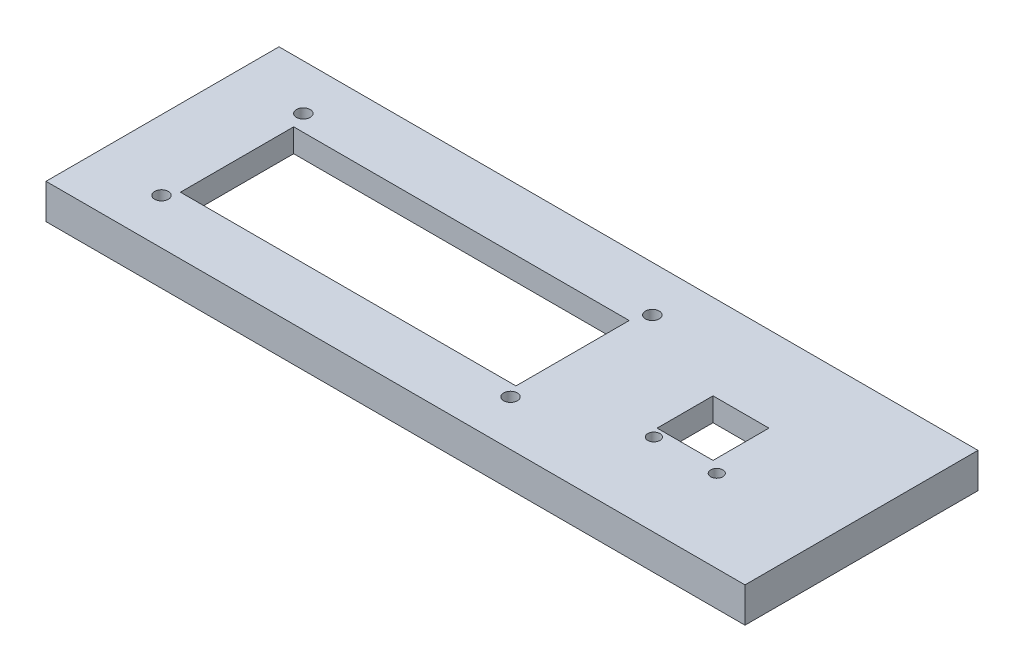
ISO-10303-21;
HEADER;
FILE_DESCRIPTION(('STEP AP214'),'2;1');
FILE_NAME('part.step','',(''),(''),'','','');
FILE_SCHEMA(('AUTOMOTIVE_DESIGN { 1 0 10303 214 1 1 1 1 }'));
ENDSEC;
DATA;
#1=APPLICATION_CONTEXT('core data for automotive mechanical design processes');
#2=APPLICATION_PROTOCOL_DEFINITION('international standard','automotive_design',2000,#1);
#3=PRODUCT_CONTEXT('',#1,'mechanical');
#4=PRODUCT('Part','Part','',(#3));
#5=PRODUCT_RELATED_PRODUCT_CATEGORY('part','',(#4));
#6=PRODUCT_DEFINITION_FORMATION('','',#4);
#7=PRODUCT_DEFINITION_CONTEXT('part definition',#1,'design');
#8=PRODUCT_DEFINITION('design','',#6,#7);
#9=PRODUCT_DEFINITION_SHAPE('','',#8);
#10=(LENGTH_UNIT() NAMED_UNIT(*) SI_UNIT(.MILLI.,.METRE.));
#11=(NAMED_UNIT(*) PLANE_ANGLE_UNIT() SI_UNIT($,.RADIAN.));
#12=(NAMED_UNIT(*) SI_UNIT($,.STERADIAN.) SOLID_ANGLE_UNIT());
#13=UNCERTAINTY_MEASURE_WITH_UNIT(LENGTH_MEASURE(1.E-05),#10,'distance_accuracy_value','');
#14=(GEOMETRIC_REPRESENTATION_CONTEXT(3) GLOBAL_UNCERTAINTY_ASSIGNED_CONTEXT((#13)) GLOBAL_UNIT_ASSIGNED_CONTEXT((#10,
#11,#12)) REPRESENTATION_CONTEXT('',''));
#15=CARTESIAN_POINT('',(0.,0.,0.));
#16=DIRECTION('',(0.,0.,1.));
#17=DIRECTION('',(1.,0.,0.));
#18=AXIS2_PLACEMENT_3D('',#15,#16,#17);
#19=CARTESIAN_POINT('',(15.,0.,-40.2163222930002));
#20=DIRECTION('',(0.,1.,0.));
#21=DIRECTION('',(0.,0.,1.));
#22=AXIS2_PLACEMENT_3D('',#19,#20,#21);
#23=CYLINDRICAL_SURFACE('',#22,1.475);
#24=CARTESIAN_POINT('',(15.,7.5,-40.2163222930002));
#25=DIRECTION('',(0.,1.,0.));
#26=DIRECTION('',(0.,0.,1.));
#27=AXIS2_PLACEMENT_3D('',#24,#25,#26);
#28=CIRCLE('',#27,1.475);
#29=CARTESIAN_POINT('',(15.,7.5,-38.7413222930003));
#30=VERTEX_POINT('',#29);
#31=EDGE_CURVE('E253',#30,#30,#28,.T.);
#32=ORIENTED_EDGE('',*,*,#31,.T.);
#33=EDGE_LOOP('',(#32));
#34=FACE_BOUND('',#33,.T.);
#35=CARTESIAN_POINT('',(15.,2.5,-40.2163222930002));
#36=DIRECTION('',(0.,-1.,0.));
#37=DIRECTION('',(0.,0.,-1.));
#38=AXIS2_PLACEMENT_3D('',#35,#36,#37);
#39=CIRCLE('',#38,1.475);
#40=CARTESIAN_POINT('',(15.,2.5,-41.6913222930002));
#41=VERTEX_POINT('',#40);
#42=EDGE_CURVE('E240',#41,#41,#39,.F.);
#43=ORIENTED_EDGE('',*,*,#42,.F.);
#44=EDGE_LOOP('',(#43));
#45=FACE_BOUND('',#44,.T.);
#46=ADVANCED_FACE('F39',(#34,#45),#23,.F.);
#47=CARTESIAN_POINT('',(89.9,0.,-40.2163222930002));
#48=DIRECTION('',(0.,1.,0.));
#49=DIRECTION('',(0.,0.,1.));
#50=AXIS2_PLACEMENT_3D('',#47,#48,#49);
#51=CYLINDRICAL_SURFACE('',#50,1.475);
#52=CARTESIAN_POINT('',(89.9,7.5,-40.2163222930002));
#53=DIRECTION('',(0.,1.,0.));
#54=DIRECTION('',(0.,0.,1.));
#55=AXIS2_PLACEMENT_3D('',#52,#53,#54);
#56=CIRCLE('',#55,1.475);
#57=CARTESIAN_POINT('',(89.9,7.5,-38.7413222930003));
#58=VERTEX_POINT('',#57);
#59=EDGE_CURVE('E250',#58,#58,#56,.T.);
#60=ORIENTED_EDGE('',*,*,#59,.T.);
#61=EDGE_LOOP('',(#60));
#62=FACE_BOUND('',#61,.T.);
#63=CARTESIAN_POINT('',(89.9,2.5,-40.2163222930002));
#64=DIRECTION('',(0.,-1.,0.));
#65=DIRECTION('',(0.,0.,-1.));
#66=AXIS2_PLACEMENT_3D('',#63,#64,#65);
#67=CIRCLE('',#66,1.475);
#68=CARTESIAN_POINT('',(89.9,2.5,-41.6913222930002));
#69=VERTEX_POINT('',#68);
#70=EDGE_CURVE('E237',#69,#69,#67,.F.);
#71=ORIENTED_EDGE('',*,*,#70,.F.);
#72=EDGE_LOOP('',(#71));
#73=FACE_BOUND('',#72,.T.);
#74=ADVANCED_FACE('F327',(#62,#73),#51,.F.);
#75=CARTESIAN_POINT('',(89.9,0.,-9.78367770699974));
#76=DIRECTION('',(0.,1.,0.));
#77=DIRECTION('',(0.,0.,1.));
#78=AXIS2_PLACEMENT_3D('',#75,#76,#77);
#79=CYLINDRICAL_SURFACE('',#78,1.475);
#80=CARTESIAN_POINT('',(89.9,7.5,-9.78367770699974));
#81=DIRECTION('',(0.,1.,0.));
#82=DIRECTION('',(0.,0.,1.));
#83=AXIS2_PLACEMENT_3D('',#80,#81,#82);
#84=CIRCLE('',#83,1.475);
#85=CARTESIAN_POINT('',(89.9,7.5,-8.30867770699974));
#86=VERTEX_POINT('',#85);
#87=EDGE_CURVE('E254',#86,#86,#84,.T.);
#88=ORIENTED_EDGE('',*,*,#87,.T.);
#89=EDGE_LOOP('',(#88));
#90=FACE_BOUND('',#89,.T.);
#91=CARTESIAN_POINT('',(89.9,2.5,-9.78367770699974));
#92=DIRECTION('',(0.,-1.,0.));
#93=DIRECTION('',(0.,0.,-1.));
#94=AXIS2_PLACEMENT_3D('',#91,#92,#93);
#95=CIRCLE('',#94,1.475);
#96=CARTESIAN_POINT('',(89.9,2.5,-11.2586777069997));
#97=VERTEX_POINT('',#96);
#98=EDGE_CURVE('E234',#97,#97,#95,.F.);
#99=ORIENTED_EDGE('',*,*,#98,.F.);
#100=EDGE_LOOP('',(#99));
#101=FACE_BOUND('',#100,.T.);
#102=ADVANCED_FACE('F334',(#90,#101),#79,.F.);
#103=CARTESIAN_POINT('',(15.,0.,-9.78367770699972));
#104=DIRECTION('',(0.,1.,0.));
#105=DIRECTION('',(0.,0.,1.));
#106=AXIS2_PLACEMENT_3D('',#103,#104,#105);
#107=CYLINDRICAL_SURFACE('',#106,1.475);
#108=CARTESIAN_POINT('',(15.,7.5,-9.78367770699972));
#109=DIRECTION('',(0.,1.,0.));
#110=DIRECTION('',(0.,0.,1.));
#111=AXIS2_PLACEMENT_3D('',#108,#109,#110);
#112=CIRCLE('',#111,1.475);
#113=CARTESIAN_POINT('',(15.,7.5,-8.30867770699972));
#114=VERTEX_POINT('',#113);
#115=EDGE_CURVE('E247',#114,#114,#112,.T.);
#116=ORIENTED_EDGE('',*,*,#115,.T.);
#117=EDGE_LOOP('',(#116));
#118=FACE_BOUND('',#117,.T.);
#119=CARTESIAN_POINT('',(15.,2.5,-9.78367770699972));
#120=DIRECTION('',(0.,-1.,0.));
#121=DIRECTION('',(0.,0.,-1.));
#122=AXIS2_PLACEMENT_3D('',#119,#120,#121);
#123=CIRCLE('',#122,1.475);
#124=CARTESIAN_POINT('',(15.,2.5,-11.2586777069997));
#125=VERTEX_POINT('',#124);
#126=EDGE_CURVE('E231',#125,#125,#123,.F.);
#127=ORIENTED_EDGE('',*,*,#126,.F.);
#128=EDGE_LOOP('',(#127));
#129=FACE_BOUND('',#128,.T.);
#130=ADVANCED_FACE('F340',(#118,#129),#107,.F.);
#131=CARTESIAN_POINT('',(126.238384591535,0.,-17.7));
#132=DIRECTION('',(0.,1.,0.));
#133=DIRECTION('',(0.,0.,1.));
#134=AXIS2_PLACEMENT_3D('',#131,#132,#133);
#135=CYLINDRICAL_SURFACE('',#134,1.30000000000001);
#136=CARTESIAN_POINT('',(126.238384591535,7.5,-17.7));
#137=DIRECTION('',(0.,1.,0.));
#138=DIRECTION('',(0.,0.,1.));
#139=AXIS2_PLACEMENT_3D('',#136,#137,#138);
#140=CIRCLE('',#139,1.30000000000001);
#141=CARTESIAN_POINT('',(126.238384591535,7.5,-16.4));
#142=VERTEX_POINT('',#141);
#143=EDGE_CURVE('E243',#142,#142,#140,.T.);
#144=ORIENTED_EDGE('',*,*,#143,.T.);
#145=EDGE_LOOP('',(#144));
#146=FACE_BOUND('',#145,.T.);
#147=CARTESIAN_POINT('',(126.238384591535,2.5,-17.7));
#148=DIRECTION('',(0.,-1.,0.));
#149=DIRECTION('',(0.,0.,-1.));
#150=AXIS2_PLACEMENT_3D('',#147,#148,#149);
#151=CIRCLE('',#150,1.30000000000001);
#152=CARTESIAN_POINT('',(126.238384591535,2.5,-19.));
#153=VERTEX_POINT('',#152);
#154=EDGE_CURVE('E228',#153,#153,#151,.F.);
#155=ORIENTED_EDGE('',*,*,#154,.F.);
#156=EDGE_LOOP('',(#155));
#157=FACE_BOUND('',#156,.T.);
#158=ADVANCED_FACE('F378',(#146,#157),#135,.F.);
#159=CARTESIAN_POINT('',(112.738384591535,0.,-17.7));
#160=DIRECTION('',(0.,1.,0.));
#161=DIRECTION('',(0.,0.,1.));
#162=AXIS2_PLACEMENT_3D('',#159,#160,#161);
#163=CYLINDRICAL_SURFACE('',#162,1.29999999999999);
#164=CARTESIAN_POINT('',(112.738384591535,7.5,-17.7));
#165=DIRECTION('',(0.,1.,0.));
#166=DIRECTION('',(0.,0.,1.));
#167=AXIS2_PLACEMENT_3D('',#164,#165,#166);
#168=CIRCLE('',#167,1.29999999999999);
#169=CARTESIAN_POINT('',(112.738384591535,7.5,-16.4));
#170=VERTEX_POINT('',#169);
#171=EDGE_CURVE('E244',#170,#170,#168,.T.);
#172=ORIENTED_EDGE('',*,*,#171,.T.);
#173=EDGE_LOOP('',(#172));
#174=FACE_BOUND('',#173,.T.);
#175=CARTESIAN_POINT('',(112.738384591535,2.5,-17.7));
#176=DIRECTION('',(0.,-1.,0.));
#177=DIRECTION('',(0.,0.,-1.));
#178=AXIS2_PLACEMENT_3D('',#175,#176,#177);
#179=CIRCLE('',#178,1.29999999999999);
#180=CARTESIAN_POINT('',(112.738384591535,2.5,-19.));
#181=VERTEX_POINT('',#180);
#182=EDGE_CURVE('E227',#181,#181,#179,.F.);
#183=ORIENTED_EDGE('',*,*,#182,.F.);
#184=EDGE_LOOP('',(#183));
#185=FACE_BOUND('',#184,.T.);
#186=ADVANCED_FACE('F361',(#174,#185),#163,.F.);
#187=CARTESIAN_POINT('',(0.,7.5,0.));
#188=DIRECTION('',(1.,0.,0.));
#189=DIRECTION('',(0.,0.,-1.));
#190=AXIS2_PLACEMENT_3D('',#187,#188,#189);
#191=PLANE('',#190);
#192=DIRECTION('',(0.,0.,1.));
#193=VECTOR('',#192,1.);
#194=CARTESIAN_POINT('',(0.,0.,0.));
#195=LINE('',#194,#193);
#196=CARTESIAN_POINT('',(0.,0.,-50.));
#197=VERTEX_POINT('',#196);
#198=CARTESIAN_POINT('',(0.,0.,0.));
#199=VERTEX_POINT('',#198);
#200=EDGE_CURVE('E261',#197,#199,#195,.T.);
#201=ORIENTED_EDGE('',*,*,#200,.T.);
#202=DIRECTION('',(0.,-1.,0.));
#203=VECTOR('',#202,1.);
#204=CARTESIAN_POINT('',(0.,7.5,0.));
#205=LINE('',#204,#203);
#206=CARTESIAN_POINT('',(0.,7.5,0.));
#207=VERTEX_POINT('',#206);
#208=EDGE_CURVE('E288',#207,#199,#205,.T.);
#209=ORIENTED_EDGE('',*,*,#208,.F.);
#210=DIRECTION('',(0.,0.,1.));
#211=VECTOR('',#210,1.);
#212=CARTESIAN_POINT('',(0.,7.5,0.));
#213=LINE('',#212,#211);
#214=CARTESIAN_POINT('',(0.,7.5,-50.));
#215=VERTEX_POINT('',#214);
#216=EDGE_CURVE('E262',#215,#207,#213,.T.);
#217=ORIENTED_EDGE('',*,*,#216,.F.);
#218=DIRECTION('',(0.,-1.,0.));
#219=VECTOR('',#218,1.);
#220=CARTESIAN_POINT('',(0.,7.5,-50.));
#221=LINE('',#220,#219);
#222=EDGE_CURVE('E272',#215,#197,#221,.T.);
#223=ORIENTED_EDGE('',*,*,#222,.T.);
#224=EDGE_LOOP('',(#201,#209,#217,#223));
#225=FACE_BOUND('',#224,.T.);
#226=ADVANCED_FACE('F41',(#225),#191,.F.);
#227=CARTESIAN_POINT('',(0.,7.5,0.));
#228=DIRECTION('',(0.,0.,-1.));
#229=DIRECTION('',(-1.,0.,0.));
#230=AXIS2_PLACEMENT_3D('',#227,#228,#229);
#231=PLANE('',#230);
#232=DIRECTION('',(1.,0.,0.));
#233=VECTOR('',#232,1.);
#234=CARTESIAN_POINT('',(0.,0.,0.));
#235=LINE('',#234,#233);
#236=CARTESIAN_POINT('',(150.,0.,0.));
#237=VERTEX_POINT('',#236);
#238=EDGE_CURVE('E275',#199,#237,#235,.T.);
#239=ORIENTED_EDGE('',*,*,#238,.T.);
#240=DIRECTION('',(0.,-1.,0.));
#241=VECTOR('',#240,1.);
#242=CARTESIAN_POINT('',(150.,7.5,0.));
#243=LINE('',#242,#241);
#244=CARTESIAN_POINT('',(150.,7.5,0.));
#245=VERTEX_POINT('',#244);
#246=EDGE_CURVE('E285',#245,#237,#243,.T.);
#247=ORIENTED_EDGE('',*,*,#246,.F.);
#248=DIRECTION('',(1.,0.,0.));
#249=VECTOR('',#248,1.);
#250=CARTESIAN_POINT('',(0.,7.5,0.));
#251=LINE('',#250,#249);
#252=EDGE_CURVE('E265',#207,#245,#251,.T.);
#253=ORIENTED_EDGE('',*,*,#252,.F.);
#254=ORIENTED_EDGE('',*,*,#208,.T.);
#255=EDGE_LOOP('',(#239,#247,#253,#254));
#256=FACE_BOUND('',#255,.T.);
#257=ADVANCED_FACE('F354',(#256),#231,.F.);
#258=CARTESIAN_POINT('',(150.,7.5,0.));
#259=DIRECTION('',(-1.,0.,0.));
#260=DIRECTION('',(0.,0.,1.));
#261=AXIS2_PLACEMENT_3D('',#258,#259,#260);
#262=PLANE('',#261);
#263=DIRECTION('',(0.,0.,-1.));
#264=VECTOR('',#263,1.);
#265=CARTESIAN_POINT('',(150.,0.,0.));
#266=LINE('',#265,#264);
#267=CARTESIAN_POINT('',(150.,0.,-50.));
#268=VERTEX_POINT('',#267);
#269=EDGE_CURVE('E277',#237,#268,#266,.T.);
#270=ORIENTED_EDGE('',*,*,#269,.T.);
#271=DIRECTION('',(0.,-1.,0.));
#272=VECTOR('',#271,1.);
#273=CARTESIAN_POINT('',(150.,7.5,-50.));
#274=LINE('',#273,#272);
#275=CARTESIAN_POINT('',(150.,7.5,-50.));
#276=VERTEX_POINT('',#275);
#277=EDGE_CURVE('E282',#276,#268,#274,.T.);
#278=ORIENTED_EDGE('',*,*,#277,.F.);
#279=DIRECTION('',(0.,0.,-1.));
#280=VECTOR('',#279,1.);
#281=CARTESIAN_POINT('',(150.,7.5,0.));
#282=LINE('',#281,#280);
#283=EDGE_CURVE('E268',#245,#276,#282,.T.);
#284=ORIENTED_EDGE('',*,*,#283,.F.);
#285=ORIENTED_EDGE('',*,*,#246,.T.);
#286=EDGE_LOOP('',(#270,#278,#284,#285));
#287=FACE_BOUND('',#286,.T.);
#288=ADVANCED_FACE('F351',(#287),#262,.F.);
#289=CARTESIAN_POINT('',(0.,7.5,-50.));
#290=DIRECTION('',(0.,0.,1.));
#291=DIRECTION('',(1.,0.,0.));
#292=AXIS2_PLACEMENT_3D('',#289,#290,#291);
#293=PLANE('',#292);
#294=DIRECTION('',(-1.,0.,0.));
#295=VECTOR('',#294,1.);
#296=CARTESIAN_POINT('',(0.,0.,-50.));
#297=LINE('',#296,#295);
#298=EDGE_CURVE('E266',#268,#197,#297,.T.);
#299=ORIENTED_EDGE('',*,*,#298,.T.);
#300=ORIENTED_EDGE('',*,*,#222,.F.);
#301=DIRECTION('',(-1.,0.,0.));
#302=VECTOR('',#301,1.);
#303=CARTESIAN_POINT('',(0.,7.5,-50.));
#304=LINE('',#303,#302);
#305=EDGE_CURVE('E270',#276,#215,#304,.T.);
#306=ORIENTED_EDGE('',*,*,#305,.F.);
#307=ORIENTED_EDGE('',*,*,#277,.T.);
#308=EDGE_LOOP('',(#299,#300,#306,#307));
#309=FACE_BOUND('',#308,.T.);
#310=ADVANCED_FACE('F345',(#309),#293,.F.);
#311=CARTESIAN_POINT('',(0.,7.5,0.));
#312=DIRECTION('',(0.,-1.,0.));
#313=DIRECTION('',(0.,0.,-1.));
#314=AXIS2_PLACEMENT_3D('',#311,#312,#313);
#315=PLANE('',#314);
#316=DIRECTION('',(1.,0.,0.));
#317=VECTOR('',#316,1.);
#318=CARTESIAN_POINT('',(111.438384591535,7.5,-19.7));
#319=LINE('',#318,#317);
#320=CARTESIAN_POINT('',(111.438384591535,7.5,-19.7));
#321=VERTEX_POINT('',#320);
#322=CARTESIAN_POINT('',(123.438384591535,7.5,-19.7));
#323=VERTEX_POINT('',#322);
#324=EDGE_CURVE('E163',#321,#323,#319,.T.);
#325=ORIENTED_EDGE('',*,*,#324,.F.);
#326=DIRECTION('',(0.,0.,1.));
#327=VECTOR('',#326,1.);
#328=CARTESIAN_POINT('',(111.438384591535,7.5,-31.7));
#329=LINE('',#328,#327);
#330=CARTESIAN_POINT('',(111.438384591535,7.5,-31.7));
#331=VERTEX_POINT('',#330);
#332=EDGE_CURVE('E54',#331,#321,#329,.T.);
#333=ORIENTED_EDGE('',*,*,#332,.F.);
#334=DIRECTION('',(-1.,0.,0.));
#335=VECTOR('',#334,1.);
#336=CARTESIAN_POINT('',(111.438384591535,7.5,-31.7));
#337=LINE('',#336,#335);
#338=CARTESIAN_POINT('',(123.438384591535,7.5,-31.7));
#339=VERTEX_POINT('',#338);
#340=EDGE_CURVE('E170',#339,#331,#337,.T.);
#341=ORIENTED_EDGE('',*,*,#340,.F.);
#342=DIRECTION('',(0.,0.,-1.));
#343=VECTOR('',#342,1.);
#344=CARTESIAN_POINT('',(123.438384591535,7.5,-31.7));
#345=LINE('',#344,#343);
#346=EDGE_CURVE('E154',#323,#339,#345,.T.);
#347=ORIENTED_EDGE('',*,*,#346,.F.);
#348=EDGE_LOOP('',(#325,#333,#341,#347));
#349=FACE_BOUND('',#348,.T.);
#350=DIRECTION('',(1.,0.,0.));
#351=VECTOR('',#350,1.);
#352=CARTESIAN_POINT('',(16.45,7.5,-12.4));
#353=LINE('',#352,#351);
#354=CARTESIAN_POINT('',(16.45,7.5,-12.4));
#355=VERTEX_POINT('',#354);
#356=CARTESIAN_POINT('',(88.45,7.5,-12.4));
#357=VERTEX_POINT('',#356);
#358=EDGE_CURVE('E181',#355,#357,#353,.T.);
#359=ORIENTED_EDGE('',*,*,#358,.F.);
#360=DIRECTION('',(0.,0.,1.));
#361=VECTOR('',#360,1.);
#362=CARTESIAN_POINT('',(16.45,7.5,-36.7));
#363=LINE('',#362,#361);
#364=CARTESIAN_POINT('',(16.45,7.5,-36.7));
#365=VERTEX_POINT('',#364);
#366=EDGE_CURVE('E177',#365,#355,#363,.T.);
#367=ORIENTED_EDGE('',*,*,#366,.F.);
#368=DIRECTION('',(-1.,0.,0.));
#369=VECTOR('',#368,1.);
#370=CARTESIAN_POINT('',(16.45,7.5,-36.7));
#371=LINE('',#370,#369);
#372=CARTESIAN_POINT('',(88.45,7.5,-36.7));
#373=VERTEX_POINT('',#372);
#374=EDGE_CURVE('E187',#373,#365,#371,.T.);
#375=ORIENTED_EDGE('',*,*,#374,.F.);
#376=DIRECTION('',(0.,0.,-1.));
#377=VECTOR('',#376,1.);
#378=CARTESIAN_POINT('',(88.45,7.5,-36.7));
#379=LINE('',#378,#377);
#380=EDGE_CURVE('E184',#357,#373,#379,.T.);
#381=ORIENTED_EDGE('',*,*,#380,.F.);
#382=EDGE_LOOP('',(#359,#367,#375,#381));
#383=FACE_BOUND('',#382,.T.);
#384=ORIENTED_EDGE('',*,*,#171,.F.);
#385=EDGE_LOOP('',(#384));
#386=FACE_BOUND('',#385,.T.);
#387=ORIENTED_EDGE('',*,*,#143,.F.);
#388=EDGE_LOOP('',(#387));
#389=FACE_BOUND('',#388,.T.);
#390=ORIENTED_EDGE('',*,*,#115,.F.);
#391=EDGE_LOOP('',(#390));
#392=FACE_BOUND('',#391,.T.);
#393=ORIENTED_EDGE('',*,*,#87,.F.);
#394=EDGE_LOOP('',(#393));
#395=FACE_BOUND('',#394,.T.);
#396=ORIENTED_EDGE('',*,*,#59,.F.);
#397=EDGE_LOOP('',(#396));
#398=FACE_BOUND('',#397,.T.);
#399=ORIENTED_EDGE('',*,*,#31,.F.);
#400=EDGE_LOOP('',(#399));
#401=FACE_BOUND('',#400,.T.);
#402=ORIENTED_EDGE('',*,*,#216,.T.);
#403=ORIENTED_EDGE('',*,*,#252,.T.);
#404=ORIENTED_EDGE('',*,*,#283,.T.);
#405=ORIENTED_EDGE('',*,*,#305,.T.);
#406=EDGE_LOOP('',(#402,#403,#404,#405));
#407=FACE_BOUND('',#406,.T.);
#408=ADVANCED_FACE('F167',(#349,#383,#386,#389,#392,#395,#398,#401,#407),#315,.F.);
#409=CARTESIAN_POINT('',(0.,0.,0.));
#410=DIRECTION('',(0.,-1.,0.));
#411=DIRECTION('',(0.,0.,-1.));
#412=AXIS2_PLACEMENT_3D('',#409,#410,#411);
#413=PLANE('',#412);
#414=DIRECTION('',(1.,0.,0.));
#415=VECTOR('',#414,1.);
#416=CARTESIAN_POINT('',(5.,0.,-45.));
#417=LINE('',#416,#415);
#418=CARTESIAN_POINT('',(5.,0.,-45.));
#419=VERTEX_POINT('',#418);
#420=CARTESIAN_POINT('',(145.,0.,-45.));
#421=VERTEX_POINT('',#420);
#422=EDGE_CURVE('E193',#419,#421,#417,.T.);
#423=ORIENTED_EDGE('',*,*,#422,.F.);
#424=DIRECTION('',(0.,0.,-1.));
#425=VECTOR('',#424,1.);
#426=CARTESIAN_POINT('',(5.,0.,-5.));
#427=LINE('',#426,#425);
#428=CARTESIAN_POINT('',(5.,0.,-5.));
#429=VERTEX_POINT('',#428);
#430=EDGE_CURVE('E215',#429,#419,#427,.T.);
#431=ORIENTED_EDGE('',*,*,#430,.F.);
#432=DIRECTION('',(-1.,0.,0.));
#433=VECTOR('',#432,1.);
#434=CARTESIAN_POINT('',(145.,0.,-5.));
#435=LINE('',#434,#433);
#436=CARTESIAN_POINT('',(145.,0.,-5.));
#437=VERTEX_POINT('',#436);
#438=EDGE_CURVE('E212',#437,#429,#435,.T.);
#439=ORIENTED_EDGE('',*,*,#438,.F.);
#440=DIRECTION('',(0.,0.,1.));
#441=VECTOR('',#440,1.);
#442=CARTESIAN_POINT('',(145.,0.,-45.));
#443=LINE('',#442,#441);
#444=EDGE_CURVE('E209',#421,#437,#443,.T.);
#445=ORIENTED_EDGE('',*,*,#444,.F.);
#446=EDGE_LOOP('',(#423,#431,#439,#445));
#447=FACE_BOUND('',#446,.T.);
#448=ORIENTED_EDGE('',*,*,#200,.F.);
#449=ORIENTED_EDGE('',*,*,#298,.F.);
#450=ORIENTED_EDGE('',*,*,#269,.F.);
#451=ORIENTED_EDGE('',*,*,#238,.F.);
#452=EDGE_LOOP('',(#448,#449,#450,#451));
#453=FACE_BOUND('',#452,.T.);
#454=ADVANCED_FACE('F344',(#447,#453),#413,.T.);
#455=CARTESIAN_POINT('',(0.,2.5,0.));
#456=DIRECTION('',(0.,-1.,0.));
#457=DIRECTION('',(0.,0.,-1.));
#458=AXIS2_PLACEMENT_3D('',#455,#456,#457);
#459=PLANE('',#458);
#460=DIRECTION('',(0.,0.,-1.));
#461=VECTOR('',#460,1.);
#462=CARTESIAN_POINT('',(111.438384591535,2.5,0.));
#463=LINE('',#462,#461);
#464=CARTESIAN_POINT('',(111.438384591535,2.5,-19.7));
#465=VERTEX_POINT('',#464);
#466=CARTESIAN_POINT('',(111.438384591535,2.5,-31.7));
#467=VERTEX_POINT('',#466);
#468=EDGE_CURVE('E12',#465,#467,#463,.T.);
#469=ORIENTED_EDGE('',*,*,#468,.F.);
#470=DIRECTION('',(-1.,0.,0.));
#471=VECTOR('',#470,1.);
#472=CARTESIAN_POINT('',(0.,2.5,-19.7));
#473=LINE('',#472,#471);
#474=CARTESIAN_POINT('',(123.438384591535,2.5,-19.7));
#475=VERTEX_POINT('',#474);
#476=EDGE_CURVE('E302',#475,#465,#473,.T.);
#477=ORIENTED_EDGE('',*,*,#476,.F.);
#478=DIRECTION('',(0.,0.,1.));
#479=VECTOR('',#478,1.);
#480=CARTESIAN_POINT('',(123.438384591535,2.5,0.));
#481=LINE('',#480,#479);
#482=CARTESIAN_POINT('',(123.438384591535,2.5,-31.7));
#483=VERTEX_POINT('',#482);
#484=EDGE_CURVE('E157',#483,#475,#481,.T.);
#485=ORIENTED_EDGE('',*,*,#484,.F.);
#486=DIRECTION('',(1.,0.,0.));
#487=VECTOR('',#486,1.);
#488=CARTESIAN_POINT('',(0.,2.5,-31.7));
#489=LINE('',#488,#487);
#490=EDGE_CURVE('E47',#467,#483,#489,.T.);
#491=ORIENTED_EDGE('',*,*,#490,.F.);
#492=EDGE_LOOP('',(#469,#477,#485,#491));
#493=FACE_BOUND('',#492,.T.);
#494=DIRECTION('',(0.,0.,-1.));
#495=VECTOR('',#494,1.);
#496=CARTESIAN_POINT('',(16.45,2.5,0.));
#497=LINE('',#496,#495);
#498=CARTESIAN_POINT('',(16.45,2.5,-12.4));
#499=VERTEX_POINT('',#498);
#500=CARTESIAN_POINT('',(16.45,2.5,-36.7));
#501=VERTEX_POINT('',#500);
#502=EDGE_CURVE('E300',#499,#501,#497,.T.);
#503=ORIENTED_EDGE('',*,*,#502,.F.);
#504=DIRECTION('',(-1.,0.,0.));
#505=VECTOR('',#504,1.);
#506=CARTESIAN_POINT('',(0.,2.5,-12.4));
#507=LINE('',#506,#505);
#508=CARTESIAN_POINT('',(88.45,2.5,-12.4));
#509=VERTEX_POINT('',#508);
#510=EDGE_CURVE('E291',#509,#499,#507,.T.);
#511=ORIENTED_EDGE('',*,*,#510,.F.);
#512=DIRECTION('',(0.,0.,1.));
#513=VECTOR('',#512,1.);
#514=CARTESIAN_POINT('',(88.45,2.5,0.));
#515=LINE('',#514,#513);
#516=CARTESIAN_POINT('',(88.45,2.5,-36.7));
#517=VERTEX_POINT('',#516);
#518=EDGE_CURVE('E295',#517,#509,#515,.T.);
#519=ORIENTED_EDGE('',*,*,#518,.F.);
#520=DIRECTION('',(1.,0.,0.));
#521=VECTOR('',#520,1.);
#522=CARTESIAN_POINT('',(0.,2.5,-36.7));
#523=LINE('',#522,#521);
#524=EDGE_CURVE('E298',#501,#517,#523,.T.);
#525=ORIENTED_EDGE('',*,*,#524,.F.);
#526=EDGE_LOOP('',(#503,#511,#519,#525));
#527=FACE_BOUND('',#526,.T.);
#528=DIRECTION('',(-1.,0.,0.));
#529=VECTOR('',#528,1.);
#530=CARTESIAN_POINT('',(5.,2.5,-45.));
#531=LINE('',#530,#529);
#532=CARTESIAN_POINT('',(145.,2.5,-45.));
#533=VERTEX_POINT('',#532);
#534=CARTESIAN_POINT('',(5.,2.5,-45.));
#535=VERTEX_POINT('',#534);
#536=EDGE_CURVE('E205',#533,#535,#531,.T.);
#537=ORIENTED_EDGE('',*,*,#536,.F.);
#538=DIRECTION('',(0.,0.,-1.));
#539=VECTOR('',#538,1.);
#540=CARTESIAN_POINT('',(145.,2.5,-45.));
#541=LINE('',#540,#539);
#542=CARTESIAN_POINT('',(145.,2.5,-5.));
#543=VERTEX_POINT('',#542);
#544=EDGE_CURVE('E207',#543,#533,#541,.T.);
#545=ORIENTED_EDGE('',*,*,#544,.F.);
#546=DIRECTION('',(1.,0.,0.));
#547=VECTOR('',#546,1.);
#548=CARTESIAN_POINT('',(145.,2.5,-5.));
#549=LINE('',#548,#547);
#550=CARTESIAN_POINT('',(5.,2.5,-5.));
#551=VERTEX_POINT('',#550);
#552=EDGE_CURVE('E200',#551,#543,#549,.T.);
#553=ORIENTED_EDGE('',*,*,#552,.F.);
#554=DIRECTION('',(0.,0.,1.));
#555=VECTOR('',#554,1.);
#556=CARTESIAN_POINT('',(5.,2.5,-5.));
#557=LINE('',#556,#555);
#558=EDGE_CURVE('E202',#535,#551,#557,.T.);
#559=ORIENTED_EDGE('',*,*,#558,.F.);
#560=EDGE_LOOP('',(#537,#545,#553,#559));
#561=FACE_BOUND('',#560,.T.);
#562=ORIENTED_EDGE('',*,*,#182,.T.);
#563=EDGE_LOOP('',(#562));
#564=FACE_BOUND('',#563,.T.);
#565=ORIENTED_EDGE('',*,*,#154,.T.);
#566=EDGE_LOOP('',(#565));
#567=FACE_BOUND('',#566,.T.);
#568=ORIENTED_EDGE('',*,*,#126,.T.);
#569=EDGE_LOOP('',(#568));
#570=FACE_BOUND('',#569,.T.);
#571=ORIENTED_EDGE('',*,*,#98,.T.);
#572=EDGE_LOOP('',(#571));
#573=FACE_BOUND('',#572,.T.);
#574=ORIENTED_EDGE('',*,*,#70,.T.);
#575=EDGE_LOOP('',(#574));
#576=FACE_BOUND('',#575,.T.);
#577=ORIENTED_EDGE('',*,*,#42,.T.);
#578=EDGE_LOOP('',(#577));
#579=FACE_BOUND('',#578,.T.);
#580=ADVANCED_FACE('F310',(#493,#527,#561,#564,#567,#570,#573,#576,#579),#459,.T.);
#581=CARTESIAN_POINT('',(5.,153.10219778561,-45.));
#582=DIRECTION('',(0.,0.,-1.));
#583=DIRECTION('',(-1.,0.,0.));
#584=AXIS2_PLACEMENT_3D('',#581,#582,#583);
#585=PLANE('',#584);
#586=ORIENTED_EDGE('',*,*,#536,.T.);
#587=DIRECTION('',(0.,-1.,0.));
#588=VECTOR('',#587,1.);
#589=CARTESIAN_POINT('',(5.,153.10219778561,-45.));
#590=LINE('',#589,#588);
#591=EDGE_CURVE('E203',#535,#419,#590,.T.);
#592=ORIENTED_EDGE('',*,*,#591,.T.);
#593=ORIENTED_EDGE('',*,*,#422,.T.);
#594=DIRECTION('',(0.,-1.,0.));
#595=VECTOR('',#594,1.);
#596=CARTESIAN_POINT('',(145.,153.10219778561,-45.));
#597=LINE('',#596,#595);
#598=EDGE_CURVE('E218',#533,#421,#597,.T.);
#599=ORIENTED_EDGE('',*,*,#598,.F.);
#600=EDGE_LOOP('',(#586,#592,#593,#599));
#601=FACE_BOUND('',#600,.T.);
#602=ADVANCED_FACE('F389',(#601),#585,.F.);
#603=CARTESIAN_POINT('',(5.,153.10219778561,-5.));
#604=DIRECTION('',(-1.,0.,0.));
#605=DIRECTION('',(0.,0.,1.));
#606=AXIS2_PLACEMENT_3D('',#603,#604,#605);
#607=PLANE('',#606);
#608=ORIENTED_EDGE('',*,*,#558,.T.);
#609=DIRECTION('',(0.,-1.,0.));
#610=VECTOR('',#609,1.);
#611=CARTESIAN_POINT('',(5.,153.10219778561,-5.));
#612=LINE('',#611,#610);
#613=EDGE_CURVE('E220',#551,#429,#612,.T.);
#614=ORIENTED_EDGE('',*,*,#613,.T.);
#615=ORIENTED_EDGE('',*,*,#430,.T.);
#616=ORIENTED_EDGE('',*,*,#591,.F.);
#617=EDGE_LOOP('',(#608,#614,#615,#616));
#618=FACE_BOUND('',#617,.T.);
#619=ADVANCED_FACE('F410',(#618),#607,.F.);
#620=CARTESIAN_POINT('',(145.,153.10219778561,-5.));
#621=DIRECTION('',(0.,0.,1.));
#622=DIRECTION('',(1.,0.,0.));
#623=AXIS2_PLACEMENT_3D('',#620,#621,#622);
#624=PLANE('',#623);
#625=ORIENTED_EDGE('',*,*,#552,.T.);
#626=DIRECTION('',(0.,-1.,0.));
#627=VECTOR('',#626,1.);
#628=CARTESIAN_POINT('',(145.,153.10219778561,-5.));
#629=LINE('',#628,#627);
#630=EDGE_CURVE('E222',#543,#437,#629,.T.);
#631=ORIENTED_EDGE('',*,*,#630,.T.);
#632=ORIENTED_EDGE('',*,*,#438,.T.);
#633=ORIENTED_EDGE('',*,*,#613,.F.);
#634=EDGE_LOOP('',(#625,#631,#632,#633));
#635=FACE_BOUND('',#634,.T.);
#636=ADVANCED_FACE('F417',(#635),#624,.F.);
#637=CARTESIAN_POINT('',(145.,153.10219778561,-45.));
#638=DIRECTION('',(1.,0.,0.));
#639=DIRECTION('',(0.,0.,-1.));
#640=AXIS2_PLACEMENT_3D('',#637,#638,#639);
#641=PLANE('',#640);
#642=ORIENTED_EDGE('',*,*,#544,.T.);
#643=ORIENTED_EDGE('',*,*,#598,.T.);
#644=ORIENTED_EDGE('',*,*,#444,.T.);
#645=ORIENTED_EDGE('',*,*,#630,.F.);
#646=EDGE_LOOP('',(#642,#643,#644,#645));
#647=FACE_BOUND('',#646,.T.);
#648=ADVANCED_FACE('F420',(#647),#641,.F.);
#649=CARTESIAN_POINT('',(16.45,0.,-36.7));
#650=DIRECTION('',(-1.,0.,0.));
#651=DIRECTION('',(0.,0.,1.));
#652=AXIS2_PLACEMENT_3D('',#649,#650,#651);
#653=PLANE('',#652);
#654=ORIENTED_EDGE('',*,*,#502,.T.);
#655=DIRECTION('',(0.,1.,0.));
#656=VECTOR('',#655,1.);
#657=CARTESIAN_POINT('',(16.45,0.,-36.7));
#658=LINE('',#657,#656);
#659=EDGE_CURVE('E191',#501,#365,#658,.T.);
#660=ORIENTED_EDGE('',*,*,#659,.T.);
#661=ORIENTED_EDGE('',*,*,#366,.T.);
#662=DIRECTION('',(0.,1.,0.));
#663=VECTOR('',#662,1.);
#664=CARTESIAN_POINT('',(16.45,0.,-12.4));
#665=LINE('',#664,#663);
#666=EDGE_CURVE('E190',#499,#355,#665,.T.);
#667=ORIENTED_EDGE('',*,*,#666,.F.);
#668=EDGE_LOOP('',(#654,#660,#661,#667));
#669=FACE_BOUND('',#668,.T.);
#670=ADVANCED_FACE('F414',(#669),#653,.F.);
#671=CARTESIAN_POINT('',(16.45,0.,-36.7));
#672=DIRECTION('',(0.,0.,-1.));
#673=DIRECTION('',(-1.,0.,0.));
#674=AXIS2_PLACEMENT_3D('',#671,#672,#673);
#675=PLANE('',#674);
#676=ORIENTED_EDGE('',*,*,#524,.T.);
#677=DIRECTION('',(0.,1.,0.));
#678=VECTOR('',#677,1.);
#679=CARTESIAN_POINT('',(88.45,0.,-36.7));
#680=LINE('',#679,#678);
#681=EDGE_CURVE('E194',#517,#373,#680,.T.);
#682=ORIENTED_EDGE('',*,*,#681,.T.);
#683=ORIENTED_EDGE('',*,*,#374,.T.);
#684=ORIENTED_EDGE('',*,*,#659,.F.);
#685=EDGE_LOOP('',(#676,#682,#683,#684));
#686=FACE_BOUND('',#685,.T.);
#687=ADVANCED_FACE('F427',(#686),#675,.F.);
#688=CARTESIAN_POINT('',(88.45,0.,-36.7));
#689=DIRECTION('',(1.,0.,0.));
#690=DIRECTION('',(0.,0.,-1.));
#691=AXIS2_PLACEMENT_3D('',#688,#689,#690);
#692=PLANE('',#691);
#693=ORIENTED_EDGE('',*,*,#518,.T.);
#694=DIRECTION('',(0.,1.,0.));
#695=VECTOR('',#694,1.);
#696=CARTESIAN_POINT('',(88.45,0.,-12.4));
#697=LINE('',#696,#695);
#698=EDGE_CURVE('E196',#509,#357,#697,.T.);
#699=ORIENTED_EDGE('',*,*,#698,.T.);
#700=ORIENTED_EDGE('',*,*,#380,.T.);
#701=ORIENTED_EDGE('',*,*,#681,.F.);
#702=EDGE_LOOP('',(#693,#699,#700,#701));
#703=FACE_BOUND('',#702,.T.);
#704=ADVANCED_FACE('F321',(#703),#692,.F.);
#705=CARTESIAN_POINT('',(16.45,0.,-12.4));
#706=DIRECTION('',(0.,0.,1.));
#707=DIRECTION('',(1.,0.,0.));
#708=AXIS2_PLACEMENT_3D('',#705,#706,#707);
#709=PLANE('',#708);
#710=ORIENTED_EDGE('',*,*,#510,.T.);
#711=ORIENTED_EDGE('',*,*,#666,.T.);
#712=ORIENTED_EDGE('',*,*,#358,.T.);
#713=ORIENTED_EDGE('',*,*,#698,.F.);
#714=EDGE_LOOP('',(#710,#711,#712,#713));
#715=FACE_BOUND('',#714,.T.);
#716=ADVANCED_FACE('F314',(#715),#709,.F.);
#717=CARTESIAN_POINT('',(111.438384591535,0.,-31.7));
#718=DIRECTION('',(-1.,0.,0.));
#719=DIRECTION('',(0.,0.,1.));
#720=AXIS2_PLACEMENT_3D('',#717,#718,#719);
#721=PLANE('',#720);
#722=ORIENTED_EDGE('',*,*,#468,.T.);
#723=DIRECTION('',(0.,1.,0.));
#724=VECTOR('',#723,1.);
#725=CARTESIAN_POINT('',(111.438384591535,0.,-31.7));
#726=LINE('',#725,#724);
#727=EDGE_CURVE('E175',#467,#331,#726,.T.);
#728=ORIENTED_EDGE('',*,*,#727,.T.);
#729=ORIENTED_EDGE('',*,*,#332,.T.);
#730=DIRECTION('',(0.,1.,0.));
#731=VECTOR('',#730,1.);
#732=CARTESIAN_POINT('',(111.438384591535,0.,-19.7));
#733=LINE('',#732,#731);
#734=EDGE_CURVE('E160',#465,#321,#733,.T.);
#735=ORIENTED_EDGE('',*,*,#734,.F.);
#736=EDGE_LOOP('',(#722,#728,#729,#735));
#737=FACE_BOUND('',#736,.T.);
#738=ADVANCED_FACE('F312',(#737),#721,.F.);
#739=CARTESIAN_POINT('',(111.438384591535,0.,-31.7));
#740=DIRECTION('',(0.,0.,-1.));
#741=DIRECTION('',(-1.,0.,0.));
#742=AXIS2_PLACEMENT_3D('',#739,#740,#741);
#743=PLANE('',#742);
#744=ORIENTED_EDGE('',*,*,#490,.T.);
#745=DIRECTION('',(0.,1.,0.));
#746=VECTOR('',#745,1.);
#747=CARTESIAN_POINT('',(123.438384591535,0.,-31.7));
#748=LINE('',#747,#746);
#749=EDGE_CURVE('E159',#483,#339,#748,.T.);
#750=ORIENTED_EDGE('',*,*,#749,.T.);
#751=ORIENTED_EDGE('',*,*,#340,.T.);
#752=ORIENTED_EDGE('',*,*,#727,.F.);
#753=EDGE_LOOP('',(#744,#750,#751,#752));
#754=FACE_BOUND('',#753,.T.);
#755=ADVANCED_FACE('F307',(#754),#743,.F.);
#756=CARTESIAN_POINT('',(123.438384591535,0.,-31.7));
#757=DIRECTION('',(1.,0.,0.));
#758=DIRECTION('',(0.,0.,-1.));
#759=AXIS2_PLACEMENT_3D('',#756,#757,#758);
#760=PLANE('',#759);
#761=ORIENTED_EDGE('',*,*,#484,.T.);
#762=DIRECTION('',(0.,1.,0.));
#763=VECTOR('',#762,1.);
#764=CARTESIAN_POINT('',(123.438384591535,0.,-19.7));
#765=LINE('',#764,#763);
#766=EDGE_CURVE('E62',#475,#323,#765,.T.);
#767=ORIENTED_EDGE('',*,*,#766,.T.);
#768=ORIENTED_EDGE('',*,*,#346,.T.);
#769=ORIENTED_EDGE('',*,*,#749,.F.);
#770=EDGE_LOOP('',(#761,#767,#768,#769));
#771=FACE_BOUND('',#770,.T.);
#772=ADVANCED_FACE('F151',(#771),#760,.F.);
#773=CARTESIAN_POINT('',(111.438384591535,0.,-19.7));
#774=DIRECTION('',(0.,0.,1.));
#775=DIRECTION('',(1.,0.,0.));
#776=AXIS2_PLACEMENT_3D('',#773,#774,#775);
#777=PLANE('',#776);
#778=ORIENTED_EDGE('',*,*,#476,.T.);
#779=ORIENTED_EDGE('',*,*,#734,.T.);
#780=ORIENTED_EDGE('',*,*,#324,.T.);
#781=ORIENTED_EDGE('',*,*,#766,.F.);
#782=EDGE_LOOP('',(#778,#779,#780,#781));
#783=FACE_BOUND('',#782,.T.);
#784=ADVANCED_FACE('F164',(#783),#777,.F.);
#785=CLOSED_SHELL('',(#46,#74,#102,#130,#158,#186,#226,#257,#288,#310,#408,#454,#580,#602,#619,
#636,#648,#670,#687,#704,#716,#738,#755,#772,#784));
#786=MANIFOLD_SOLID_BREP('B2',#785);
#787=ADVANCED_BREP_SHAPE_REPRESENTATION('',(#18,#786),#14);
#788=SHAPE_DEFINITION_REPRESENTATION(#9,#787);
ENDSEC;
END-ISO-10303-21;
